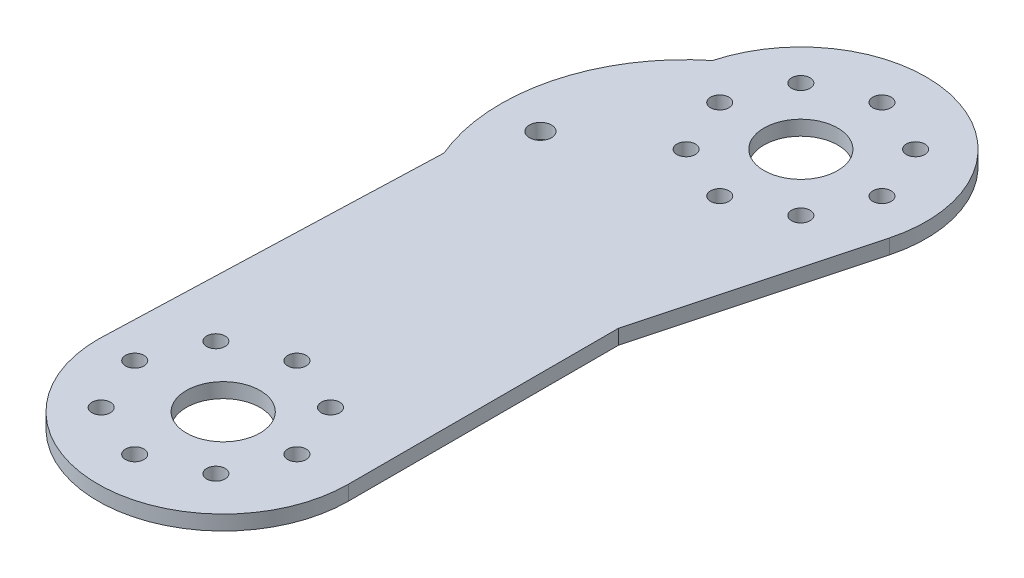
ISO-10303-21;
HEADER;
FILE_DESCRIPTION(('STEP AP214'),'2;1');
FILE_NAME('part.step','',(''),(''),'','','');
FILE_SCHEMA(('AUTOMOTIVE_DESIGN { 1 0 10303 214 1 1 1 1 }'));
ENDSEC;
DATA;
#1=APPLICATION_CONTEXT('core data for automotive mechanical design processes');
#2=APPLICATION_PROTOCOL_DEFINITION('international standard','automotive_design',2000,#1);
#3=PRODUCT_CONTEXT('',#1,'mechanical');
#4=PRODUCT('Part','Part','',(#3));
#5=PRODUCT_RELATED_PRODUCT_CATEGORY('part','',(#4));
#6=PRODUCT_DEFINITION_FORMATION('','',#4);
#7=PRODUCT_DEFINITION_CONTEXT('part definition',#1,'design');
#8=PRODUCT_DEFINITION('design','',#6,#7);
#9=PRODUCT_DEFINITION_SHAPE('','',#8);
#10=(LENGTH_UNIT() NAMED_UNIT(*) SI_UNIT(.MILLI.,.METRE.));
#11=(NAMED_UNIT(*) PLANE_ANGLE_UNIT() SI_UNIT($,.RADIAN.));
#12=(NAMED_UNIT(*) SI_UNIT($,.STERADIAN.) SOLID_ANGLE_UNIT());
#13=UNCERTAINTY_MEASURE_WITH_UNIT(LENGTH_MEASURE(1.E-05),#10,'distance_accuracy_value','');
#14=(GEOMETRIC_REPRESENTATION_CONTEXT(3) GLOBAL_UNCERTAINTY_ASSIGNED_CONTEXT((#13)) GLOBAL_UNIT_ASSIGNED_CONTEXT((#10,
#11,#12)) REPRESENTATION_CONTEXT('',''));
#15=CARTESIAN_POINT('',(0.,0.,0.));
#16=DIRECTION('',(0.,0.,1.));
#17=DIRECTION('',(1.,0.,0.));
#18=AXIS2_PLACEMENT_3D('',#15,#16,#17);
#19=CARTESIAN_POINT('',(-16.9792944272085,3.,-0.592930026825187));
#20=DIRECTION('',(-0.999390827019096,0.,-0.0348994967025082));
#21=DIRECTION('',(-0.0348994967025082,0.,0.999390827019096));
#22=AXIS2_PLACEMENT_3D('',#19,#20,#21);
#23=PLANE('',#22);
#24=DIRECTION('',(0.,1.,0.));
#25=VECTOR('',#24,1.);
#26=CARTESIAN_POINT('',(-15.4160697929704,3.,-45.3578265909523));
#27=LINE('',#26,#25);
#28=CARTESIAN_POINT('',(-15.4160697929704,1.,-45.3578265909523));
#29=VERTEX_POINT('',#28);
#30=CARTESIAN_POINT('',(-15.4160697929704,3.,-45.3578265909523));
#31=VERTEX_POINT('',#30);
#32=EDGE_CURVE('E11',#29,#31,#27,.T.);
#33=ORIENTED_EDGE('',*,*,#32,.F.);
#34=DIRECTION('',(-0.0348994967025082,0.,0.999390827019096));
#35=VECTOR('',#34,1.);
#36=CARTESIAN_POINT('',(-16.9792944272085,1.,-0.592930026825187));
#37=LINE('',#36,#35);
#38=CARTESIAN_POINT('',(-17.,1.,0.));
#39=VERTEX_POINT('',#38);
#40=EDGE_CURVE('E101',#29,#39,#37,.T.);
#41=ORIENTED_EDGE('',*,*,#40,.T.);
#42=DIRECTION('',(0.,1.,0.));
#43=VECTOR('',#42,1.);
#44=CARTESIAN_POINT('',(-17.,3.,0.));
#45=LINE('',#44,#43);
#46=CARTESIAN_POINT('',(-17.,3.,0.));
#47=VERTEX_POINT('',#46);
#48=EDGE_CURVE('E50',#39,#47,#45,.T.);
#49=ORIENTED_EDGE('',*,*,#48,.T.);
#50=DIRECTION('',(-0.0348994967025082,0.,0.999390827019096));
#51=VECTOR('',#50,1.);
#52=CARTESIAN_POINT('',(-16.9792944272085,3.,-0.592930026825187));
#53=LINE('',#52,#51);
#54=EDGE_CURVE('E131',#31,#47,#53,.T.);
#55=ORIENTED_EDGE('',*,*,#54,.F.);
#56=EDGE_LOOP('',(#33,#41,#49,#55));
#57=FACE_BOUND('',#56,.T.);
#58=ADVANCED_FACE('F40',(#57),#23,.T.);
#59=CARTESIAN_POINT('',(0.,3.,0.));
#60=DIRECTION('',(0.,1.,0.));
#61=DIRECTION('',(0.,0.,1.));
#62=AXIS2_PLACEMENT_3D('',#59,#60,#61);
#63=CYLINDRICAL_SURFACE('',#62,17.);
#64=ORIENTED_EDGE('',*,*,#48,.F.);
#65=CARTESIAN_POINT('',(0.,1.,0.));
#66=DIRECTION('',(0.,1.,0.));
#67=DIRECTION('',(0.,0.,1.));
#68=AXIS2_PLACEMENT_3D('',#65,#66,#67);
#69=CIRCLE('',#68,17.);
#70=CARTESIAN_POINT('',(17.,1.,0.));
#71=VERTEX_POINT('',#70);
#72=EDGE_CURVE('E117',#39,#71,#69,.T.);
#73=ORIENTED_EDGE('',*,*,#72,.T.);
#74=DIRECTION('',(0.,1.,0.));
#75=VECTOR('',#74,1.);
#76=CARTESIAN_POINT('',(17.,3.,0.));
#77=LINE('',#76,#75);
#78=CARTESIAN_POINT('',(17.,3.,0.));
#79=VERTEX_POINT('',#78);
#80=EDGE_CURVE('E124',#71,#79,#77,.T.);
#81=ORIENTED_EDGE('',*,*,#80,.T.);
#82=CARTESIAN_POINT('',(0.,3.,0.));
#83=DIRECTION('',(0.,1.,0.));
#84=DIRECTION('',(0.,0.,1.));
#85=AXIS2_PLACEMENT_3D('',#82,#83,#84);
#86=CIRCLE('',#85,17.);
#87=EDGE_CURVE('E139',#47,#79,#86,.T.);
#88=ORIENTED_EDGE('',*,*,#87,.F.);
#89=EDGE_LOOP('',(#64,#73,#81,#88));
#90=FACE_BOUND('',#89,.T.);
#91=ADVANCED_FACE('F142',(#90),#63,.T.);
#92=CARTESIAN_POINT('',(17.,3.,0.));
#93=DIRECTION('',(1.,0.,0.));
#94=DIRECTION('',(0.,0.,-1.));
#95=AXIS2_PLACEMENT_3D('',#92,#93,#94);
#96=PLANE('',#95);
#97=ORIENTED_EDGE('',*,*,#80,.F.);
#98=DIRECTION('',(0.,0.,1.));
#99=VECTOR('',#98,1.);
#100=CARTESIAN_POINT('',(17.,1.,0.));
#101=LINE('',#100,#99);
#102=CARTESIAN_POINT('',(17.,1.,-36.6223014445851));
#103=VERTEX_POINT('',#102);
#104=EDGE_CURVE('E114',#71,#103,#101,.F.);
#105=ORIENTED_EDGE('',*,*,#104,.T.);
#106=DIRECTION('',(0.,1.,0.));
#107=VECTOR('',#106,1.);
#108=CARTESIAN_POINT('',(17.,3.,-36.6223014445851));
#109=LINE('',#108,#107);
#110=CARTESIAN_POINT('',(17.,3.,-36.6223014445851));
#111=VERTEX_POINT('',#110);
#112=EDGE_CURVE('E122',#103,#111,#109,.T.);
#113=ORIENTED_EDGE('',*,*,#112,.T.);
#114=DIRECTION('',(0.,0.,-1.));
#115=VECTOR('',#114,1.);
#116=CARTESIAN_POINT('',(17.,3.,0.));
#117=LINE('',#116,#115);
#118=EDGE_CURVE('E143',#79,#111,#117,.T.);
#119=ORIENTED_EDGE('',*,*,#118,.F.);
#120=EDGE_LOOP('',(#97,#105,#113,#119));
#121=FACE_BOUND('',#120,.T.);
#122=ADVANCED_FACE('F228',(#121),#96,.T.);
#123=CARTESIAN_POINT('',(6.70564057102143,3.,1.79677097573857));
#124=DIRECTION('',(0.965925826289068,0.,0.258819045102521));
#125=DIRECTION('',(0.258819045102521,0.,-0.965925826289068));
#126=AXIS2_PLACEMENT_3D('',#123,#124,#125);
#127=PLANE('',#126);
#128=ORIENTED_EDGE('',*,*,#112,.F.);
#129=DIRECTION('',(0.258819045102521,0.,-0.965925826289068));
#130=VECTOR('',#129,1.);
#131=CARTESIAN_POINT('',(6.70564057102143,1.,1.79677097573857));
#132=LINE('',#131,#130);
#133=CARTESIAN_POINT('',(24.7645713530756,1.,-65.6000762332572));
#134=VERTEX_POINT('',#133);
#135=EDGE_CURVE('E111',#103,#134,#132,.T.);
#136=ORIENTED_EDGE('',*,*,#135,.T.);
#137=DIRECTION('',(0.,1.,0.));
#138=VECTOR('',#137,1.);
#139=CARTESIAN_POINT('',(24.7645713530756,3.,-65.6000762332572));
#140=LINE('',#139,#138);
#141=CARTESIAN_POINT('',(24.7645713530756,3.,-65.6000762332572));
#142=VERTEX_POINT('',#141);
#143=EDGE_CURVE('E58',#134,#142,#140,.T.);
#144=ORIENTED_EDGE('',*,*,#143,.T.);
#145=DIRECTION('',(0.258819045102521,0.,-0.965925826289068));
#146=VECTOR('',#145,1.);
#147=CARTESIAN_POINT('',(6.70564057102143,3.,1.79677097573857));
#148=LINE('',#147,#146);
#149=EDGE_CURVE('E94',#111,#142,#148,.T.);
#150=ORIENTED_EDGE('',*,*,#149,.F.);
#151=EDGE_LOOP('',(#128,#136,#144,#150));
#152=FACE_BOUND('',#151,.T.);
#153=ADVANCED_FACE('F233',(#152),#127,.T.);
#154=CARTESIAN_POINT('',(8.34383230616149,3.,-70.));
#155=DIRECTION('',(0.,1.,0.));
#156=DIRECTION('',(0.,0.,1.));
#157=AXIS2_PLACEMENT_3D('',#154,#155,#156);
#158=CYLINDRICAL_SURFACE('',#157,17.);
#159=ORIENTED_EDGE('',*,*,#143,.F.);
#160=CARTESIAN_POINT('',(8.34383230616149,1.,-70.));
#161=DIRECTION('',(0.,1.,0.));
#162=DIRECTION('',(0.,0.,1.));
#163=AXIS2_PLACEMENT_3D('',#160,#161,#162);
#164=CIRCLE('',#163,17.);
#165=CARTESIAN_POINT('',(-8.06522143351642,1.,-74.4433045549864));
#166=VERTEX_POINT('',#165);
#167=EDGE_CURVE('E99',#134,#166,#164,.T.);
#168=ORIENTED_EDGE('',*,*,#167,.T.);
#169=DIRECTION('',(0.,1.,0.));
#170=VECTOR('',#169,1.);
#171=CARTESIAN_POINT('',(-8.06522143351642,3.,-74.4433045549864));
#172=LINE('',#171,#170);
#173=CARTESIAN_POINT('',(-8.06522143351642,3.,-74.4433045549864));
#174=VERTEX_POINT('',#173);
#175=EDGE_CURVE('E44',#166,#174,#172,.T.);
#176=ORIENTED_EDGE('',*,*,#175,.T.);
#177=CARTESIAN_POINT('',(8.34383230616149,3.,-70.));
#178=DIRECTION('',(0.,1.,0.));
#179=DIRECTION('',(0.,0.,1.));
#180=AXIS2_PLACEMENT_3D('',#177,#178,#179);
#181=CIRCLE('',#180,17.);
#182=EDGE_CURVE('E333',#142,#174,#181,.T.);
#183=ORIENTED_EDGE('',*,*,#182,.F.);
#184=EDGE_LOOP('',(#159,#168,#176,#183));
#185=FACE_BOUND('',#184,.T.);
#186=ADVANCED_FACE('F103',(#185),#158,.T.);
#187=CARTESIAN_POINT('',(8.34383230616149,3.,-70.));
#188=DIRECTION('',(0.,1.,0.));
#189=DIRECTION('',(0.,0.,1.));
#190=AXIS2_PLACEMENT_3D('',#187,#188,#189);
#191=CYLINDRICAL_SURFACE('',#190,5.);
#192=CARTESIAN_POINT('',(8.34383230616149,3.,-70.));
#193=DIRECTION('',(0.,1.,0.));
#194=DIRECTION('',(0.,0.,1.));
#195=AXIS2_PLACEMENT_3D('',#192,#193,#194);
#196=CIRCLE('',#195,5.);
#197=CARTESIAN_POINT('',(8.34383230616149,3.,-65.));
#198=VERTEX_POINT('',#197);
#199=EDGE_CURVE('E113',#198,#198,#196,.T.);
#200=ORIENTED_EDGE('',*,*,#199,.T.);
#201=EDGE_LOOP('',(#200));
#202=FACE_BOUND('',#201,.T.);
#203=CARTESIAN_POINT('',(8.34383230616149,1.,-70.));
#204=DIRECTION('',(0.,1.,0.));
#205=DIRECTION('',(0.,0.,1.));
#206=AXIS2_PLACEMENT_3D('',#203,#204,#205);
#207=CIRCLE('',#206,5.);
#208=CARTESIAN_POINT('',(8.34383230616149,1.,-65.));
#209=VERTEX_POINT('',#208);
#210=EDGE_CURVE('E150',#209,#209,#207,.T.);
#211=ORIENTED_EDGE('',*,*,#210,.F.);
#212=EDGE_LOOP('',(#211));
#213=FACE_BOUND('',#212,.T.);
#214=ADVANCED_FACE('F237',(#202,#213),#191,.F.);
#215=CARTESIAN_POINT('',(8.34383230616149,3.,-59.));
#216=DIRECTION('',(0.,1.,0.));
#217=DIRECTION('',(0.,0.,1.));
#218=AXIS2_PLACEMENT_3D('',#215,#216,#217);
#219=CYLINDRICAL_SURFACE('',#218,1.25);
#220=CARTESIAN_POINT('',(8.34383230616149,3.,-59.));
#221=DIRECTION('',(0.,1.,0.));
#222=DIRECTION('',(0.,0.,1.));
#223=AXIS2_PLACEMENT_3D('',#220,#221,#222);
#224=CIRCLE('',#223,1.25);
#225=CARTESIAN_POINT('',(8.34383230616149,3.,-57.75));
#226=VERTEX_POINT('',#225);
#227=EDGE_CURVE('E347',#226,#226,#224,.T.);
#228=ORIENTED_EDGE('',*,*,#227,.T.);
#229=EDGE_LOOP('',(#228));
#230=FACE_BOUND('',#229,.T.);
#231=CARTESIAN_POINT('',(8.34383230616149,1.,-59.));
#232=DIRECTION('',(0.,1.,0.));
#233=DIRECTION('',(0.,0.,1.));
#234=AXIS2_PLACEMENT_3D('',#231,#232,#233);
#235=CIRCLE('',#234,1.25);
#236=CARTESIAN_POINT('',(8.34383230616149,1.,-57.75));
#237=VERTEX_POINT('',#236);
#238=EDGE_CURVE('E153',#237,#237,#235,.T.);
#239=ORIENTED_EDGE('',*,*,#238,.F.);
#240=EDGE_LOOP('',(#239));
#241=FACE_BOUND('',#240,.T.);
#242=ADVANCED_FACE('F241',(#230,#241),#219,.F.);
#243=CARTESIAN_POINT('',(16.1220068992135,3.,-62.221825406948));
#244=DIRECTION('',(0.,1.,0.));
#245=DIRECTION('',(0.,0.,1.));
#246=AXIS2_PLACEMENT_3D('',#243,#244,#245);
#247=CYLINDRICAL_SURFACE('',#246,1.25);
#248=CARTESIAN_POINT('',(16.1220068992135,3.,-62.221825406948));
#249=DIRECTION('',(0.,1.,0.));
#250=DIRECTION('',(0.,0.,1.));
#251=AXIS2_PLACEMENT_3D('',#248,#249,#250);
#252=CIRCLE('',#251,1.25);
#253=CARTESIAN_POINT('',(16.1220068992135,3.,-60.971825406948));
#254=VERTEX_POINT('',#253);
#255=EDGE_CURVE('E351',#254,#254,#252,.T.);
#256=ORIENTED_EDGE('',*,*,#255,.T.);
#257=EDGE_LOOP('',(#256));
#258=FACE_BOUND('',#257,.T.);
#259=CARTESIAN_POINT('',(16.1220068992135,1.,-62.221825406948));
#260=DIRECTION('',(0.,1.,0.));
#261=DIRECTION('',(0.,0.,1.));
#262=AXIS2_PLACEMENT_3D('',#259,#260,#261);
#263=CIRCLE('',#262,1.25);
#264=CARTESIAN_POINT('',(16.1220068992135,1.,-60.971825406948));
#265=VERTEX_POINT('',#264);
#266=EDGE_CURVE('E156',#265,#265,#263,.T.);
#267=ORIENTED_EDGE('',*,*,#266,.F.);
#268=EDGE_LOOP('',(#267));
#269=FACE_BOUND('',#268,.T.);
#270=ADVANCED_FACE('F247',(#258,#269),#247,.F.);
#271=CARTESIAN_POINT('',(19.3438323061615,3.,-70.));
#272=DIRECTION('',(0.,1.,0.));
#273=DIRECTION('',(0.,0.,1.));
#274=AXIS2_PLACEMENT_3D('',#271,#272,#273);
#275=CYLINDRICAL_SURFACE('',#274,1.25);
#276=CARTESIAN_POINT('',(19.3438323061615,3.,-70.));
#277=DIRECTION('',(0.,1.,0.));
#278=DIRECTION('',(0.,0.,1.));
#279=AXIS2_PLACEMENT_3D('',#276,#277,#278);
#280=CIRCLE('',#279,1.25);
#281=CARTESIAN_POINT('',(19.3438323061615,3.,-68.75));
#282=VERTEX_POINT('',#281);
#283=EDGE_CURVE('E355',#282,#282,#280,.T.);
#284=ORIENTED_EDGE('',*,*,#283,.T.);
#285=EDGE_LOOP('',(#284));
#286=FACE_BOUND('',#285,.T.);
#287=CARTESIAN_POINT('',(19.3438323061615,1.,-70.));
#288=DIRECTION('',(0.,1.,0.));
#289=DIRECTION('',(0.,0.,1.));
#290=AXIS2_PLACEMENT_3D('',#287,#288,#289);
#291=CIRCLE('',#290,1.25);
#292=CARTESIAN_POINT('',(19.3438323061615,1.,-68.75));
#293=VERTEX_POINT('',#292);
#294=EDGE_CURVE('E159',#293,#293,#291,.T.);
#295=ORIENTED_EDGE('',*,*,#294,.F.);
#296=EDGE_LOOP('',(#295));
#297=FACE_BOUND('',#296,.T.);
#298=ADVANCED_FACE('F256',(#286,#297),#275,.F.);
#299=CARTESIAN_POINT('',(16.1220068992135,3.,-77.778174593052));
#300=DIRECTION('',(0.,1.,0.));
#301=DIRECTION('',(0.,0.,1.));
#302=AXIS2_PLACEMENT_3D('',#299,#300,#301);
#303=CYLINDRICAL_SURFACE('',#302,1.25);
#304=CARTESIAN_POINT('',(16.1220068992135,3.,-77.778174593052));
#305=DIRECTION('',(0.,1.,0.));
#306=DIRECTION('',(0.,0.,1.));
#307=AXIS2_PLACEMENT_3D('',#304,#305,#306);
#308=CIRCLE('',#307,1.25);
#309=CARTESIAN_POINT('',(16.1220068992135,3.,-76.528174593052));
#310=VERTEX_POINT('',#309);
#311=EDGE_CURVE('E359',#310,#310,#308,.T.);
#312=ORIENTED_EDGE('',*,*,#311,.T.);
#313=EDGE_LOOP('',(#312));
#314=FACE_BOUND('',#313,.T.);
#315=CARTESIAN_POINT('',(16.1220068992135,1.,-77.778174593052));
#316=DIRECTION('',(0.,1.,0.));
#317=DIRECTION('',(0.,0.,1.));
#318=AXIS2_PLACEMENT_3D('',#315,#316,#317);
#319=CIRCLE('',#318,1.25);
#320=CARTESIAN_POINT('',(16.1220068992135,1.,-76.528174593052));
#321=VERTEX_POINT('',#320);
#322=EDGE_CURVE('E162',#321,#321,#319,.T.);
#323=ORIENTED_EDGE('',*,*,#322,.F.);
#324=EDGE_LOOP('',(#323));
#325=FACE_BOUND('',#324,.T.);
#326=ADVANCED_FACE('F260',(#314,#325),#303,.F.);
#327=CARTESIAN_POINT('',(8.34383230616149,3.,-81.));
#328=DIRECTION('',(0.,1.,0.));
#329=DIRECTION('',(0.,0.,1.));
#330=AXIS2_PLACEMENT_3D('',#327,#328,#329);
#331=CYLINDRICAL_SURFACE('',#330,1.25);
#332=CARTESIAN_POINT('',(8.34383230616149,3.,-81.));
#333=DIRECTION('',(0.,1.,0.));
#334=DIRECTION('',(0.,0.,1.));
#335=AXIS2_PLACEMENT_3D('',#332,#333,#334);
#336=CIRCLE('',#335,1.25);
#337=CARTESIAN_POINT('',(8.34383230616149,3.,-79.75));
#338=VERTEX_POINT('',#337);
#339=EDGE_CURVE('E363',#338,#338,#336,.T.);
#340=ORIENTED_EDGE('',*,*,#339,.T.);
#341=EDGE_LOOP('',(#340));
#342=FACE_BOUND('',#341,.T.);
#343=CARTESIAN_POINT('',(8.34383230616149,1.,-81.));
#344=DIRECTION('',(0.,1.,0.));
#345=DIRECTION('',(0.,0.,1.));
#346=AXIS2_PLACEMENT_3D('',#343,#344,#345);
#347=CIRCLE('',#346,1.25);
#348=CARTESIAN_POINT('',(8.34383230616149,1.,-79.75));
#349=VERTEX_POINT('',#348);
#350=EDGE_CURVE('E165',#349,#349,#347,.T.);
#351=ORIENTED_EDGE('',*,*,#350,.F.);
#352=EDGE_LOOP('',(#351));
#353=FACE_BOUND('',#352,.T.);
#354=ADVANCED_FACE('F264',(#342,#353),#331,.F.);
#355=CARTESIAN_POINT('',(-2.65616769383853,3.,-70.));
#356=DIRECTION('',(0.,1.,0.));
#357=DIRECTION('',(0.,0.,1.));
#358=AXIS2_PLACEMENT_3D('',#355,#356,#357);
#359=CYLINDRICAL_SURFACE('',#358,1.25);
#360=CARTESIAN_POINT('',(-2.65616769383853,3.,-70.));
#361=DIRECTION('',(0.,1.,0.));
#362=DIRECTION('',(0.,0.,1.));
#363=AXIS2_PLACEMENT_3D('',#360,#361,#362);
#364=CIRCLE('',#363,1.25);
#365=CARTESIAN_POINT('',(-2.65616769383853,3.,-68.75));
#366=VERTEX_POINT('',#365);
#367=EDGE_CURVE('E367',#366,#366,#364,.T.);
#368=ORIENTED_EDGE('',*,*,#367,.T.);
#369=EDGE_LOOP('',(#368));
#370=FACE_BOUND('',#369,.T.);
#371=CARTESIAN_POINT('',(-2.65616769383853,1.,-70.));
#372=DIRECTION('',(0.,1.,0.));
#373=DIRECTION('',(0.,0.,1.));
#374=AXIS2_PLACEMENT_3D('',#371,#372,#373);
#375=CIRCLE('',#374,1.25);
#376=CARTESIAN_POINT('',(-2.65616769383853,1.,-68.75));
#377=VERTEX_POINT('',#376);
#378=EDGE_CURVE('E168',#377,#377,#375,.T.);
#379=ORIENTED_EDGE('',*,*,#378,.F.);
#380=EDGE_LOOP('',(#379));
#381=FACE_BOUND('',#380,.T.);
#382=ADVANCED_FACE('F268',(#370,#381),#359,.F.);
#383=CARTESIAN_POINT('',(0.565657713109458,3.,-62.221825406948));
#384=DIRECTION('',(0.,1.,0.));
#385=DIRECTION('',(0.,0.,1.));
#386=AXIS2_PLACEMENT_3D('',#383,#384,#385);
#387=CYLINDRICAL_SURFACE('',#386,1.25);
#388=CARTESIAN_POINT('',(0.565657713109458,3.,-62.221825406948));
#389=DIRECTION('',(0.,1.,0.));
#390=DIRECTION('',(0.,0.,1.));
#391=AXIS2_PLACEMENT_3D('',#388,#389,#390);
#392=CIRCLE('',#391,1.25);
#393=CARTESIAN_POINT('',(0.565657713109458,3.,-60.971825406948));
#394=VERTEX_POINT('',#393);
#395=EDGE_CURVE('E371',#394,#394,#392,.T.);
#396=ORIENTED_EDGE('',*,*,#395,.T.);
#397=EDGE_LOOP('',(#396));
#398=FACE_BOUND('',#397,.T.);
#399=CARTESIAN_POINT('',(0.565657713109458,1.,-62.221825406948));
#400=DIRECTION('',(0.,1.,0.));
#401=DIRECTION('',(0.,0.,1.));
#402=AXIS2_PLACEMENT_3D('',#399,#400,#401);
#403=CIRCLE('',#402,1.25);
#404=CARTESIAN_POINT('',(0.565657713109458,1.,-60.971825406948));
#405=VERTEX_POINT('',#404);
#406=EDGE_CURVE('E171',#405,#405,#403,.T.);
#407=ORIENTED_EDGE('',*,*,#406,.F.);
#408=EDGE_LOOP('',(#407));
#409=FACE_BOUND('',#408,.T.);
#410=ADVANCED_FACE('F272',(#398,#409),#387,.F.);
#411=CARTESIAN_POINT('',(0.565657713109458,3.,-77.778174593052));
#412=DIRECTION('',(0.,1.,0.));
#413=DIRECTION('',(0.,0.,1.));
#414=AXIS2_PLACEMENT_3D('',#411,#412,#413);
#415=CYLINDRICAL_SURFACE('',#414,1.25);
#416=CARTESIAN_POINT('',(0.565657713109458,3.,-77.778174593052));
#417=DIRECTION('',(0.,1.,0.));
#418=DIRECTION('',(0.,0.,1.));
#419=AXIS2_PLACEMENT_3D('',#416,#417,#418);
#420=CIRCLE('',#419,1.25);
#421=CARTESIAN_POINT('',(0.565657713109458,3.,-76.528174593052));
#422=VERTEX_POINT('',#421);
#423=EDGE_CURVE('E375',#422,#422,#420,.T.);
#424=ORIENTED_EDGE('',*,*,#423,.T.);
#425=EDGE_LOOP('',(#424));
#426=FACE_BOUND('',#425,.T.);
#427=CARTESIAN_POINT('',(0.565657713109458,1.,-77.778174593052));
#428=DIRECTION('',(0.,1.,0.));
#429=DIRECTION('',(0.,0.,1.));
#430=AXIS2_PLACEMENT_3D('',#427,#428,#429);
#431=CIRCLE('',#430,1.25);
#432=CARTESIAN_POINT('',(0.565657713109458,1.,-76.528174593052));
#433=VERTEX_POINT('',#432);
#434=EDGE_CURVE('E174',#433,#433,#431,.T.);
#435=ORIENTED_EDGE('',*,*,#434,.F.);
#436=EDGE_LOOP('',(#435));
#437=FACE_BOUND('',#436,.T.);
#438=ADVANCED_FACE('F276',(#426,#437),#415,.F.);
#439=CARTESIAN_POINT('',(0.,3.,0.));
#440=DIRECTION('',(0.,1.,0.));
#441=DIRECTION('',(0.,0.,1.));
#442=AXIS2_PLACEMENT_3D('',#439,#440,#441);
#443=CYLINDRICAL_SURFACE('',#442,5.);
#444=CARTESIAN_POINT('',(0.,3.,0.));
#445=DIRECTION('',(0.,1.,0.));
#446=DIRECTION('',(0.,0.,1.));
#447=AXIS2_PLACEMENT_3D('',#444,#445,#446);
#448=CIRCLE('',#447,5.);
#449=CARTESIAN_POINT('',(0.,3.,5.));
#450=VERTEX_POINT('',#449);
#451=EDGE_CURVE('E379',#450,#450,#448,.T.);
#452=ORIENTED_EDGE('',*,*,#451,.T.);
#453=EDGE_LOOP('',(#452));
#454=FACE_BOUND('',#453,.T.);
#455=CARTESIAN_POINT('',(0.,1.,0.));
#456=DIRECTION('',(0.,1.,0.));
#457=DIRECTION('',(0.,0.,1.));
#458=AXIS2_PLACEMENT_3D('',#455,#456,#457);
#459=CIRCLE('',#458,5.);
#460=CARTESIAN_POINT('',(0.,1.,5.));
#461=VERTEX_POINT('',#460);
#462=EDGE_CURVE('E177',#461,#461,#459,.T.);
#463=ORIENTED_EDGE('',*,*,#462,.F.);
#464=EDGE_LOOP('',(#463));
#465=FACE_BOUND('',#464,.T.);
#466=ADVANCED_FACE('F280',(#454,#465),#443,.F.);
#467=CARTESIAN_POINT('',(-11.4160697929704,3.,-54.4433045549864));
#468=DIRECTION('',(0.,1.,0.));
#469=DIRECTION('',(0.,0.,1.));
#470=AXIS2_PLACEMENT_3D('',#467,#468,#469);
#471=CYLINDRICAL_SURFACE('',#470,1.5);
#472=CARTESIAN_POINT('',(-11.4160697929704,3.,-54.4433045549864));
#473=DIRECTION('',(0.,1.,0.));
#474=DIRECTION('',(0.,0.,1.));
#475=AXIS2_PLACEMENT_3D('',#472,#473,#474);
#476=CIRCLE('',#475,1.5);
#477=CARTESIAN_POINT('',(-11.4160697929704,3.,-52.9433045549864));
#478=VERTEX_POINT('',#477);
#479=EDGE_CURVE('E383',#478,#478,#476,.T.);
#480=ORIENTED_EDGE('',*,*,#479,.T.);
#481=EDGE_LOOP('',(#480));
#482=FACE_BOUND('',#481,.T.);
#483=CARTESIAN_POINT('',(-11.4160697929704,1.,-54.4433045549864));
#484=DIRECTION('',(0.,1.,0.));
#485=DIRECTION('',(0.,0.,1.));
#486=AXIS2_PLACEMENT_3D('',#483,#484,#485);
#487=CIRCLE('',#486,1.5);
#488=CARTESIAN_POINT('',(-11.4160697929704,1.,-52.9433045549864));
#489=VERTEX_POINT('',#488);
#490=EDGE_CURVE('E180',#489,#489,#487,.T.);
#491=ORIENTED_EDGE('',*,*,#490,.F.);
#492=EDGE_LOOP('',(#491));
#493=FACE_BOUND('',#492,.T.);
#494=ADVANCED_FACE('F284',(#482,#493),#471,.F.);
#495=CARTESIAN_POINT('',(-0.999999999999996,3.,-11.));
#496=DIRECTION('',(0.,1.,0.));
#497=DIRECTION('',(0.,0.,1.));
#498=AXIS2_PLACEMENT_3D('',#495,#496,#497);
#499=CYLINDRICAL_SURFACE('',#498,1.25);
#500=CARTESIAN_POINT('',(-0.999999999999996,3.,-11.));
#501=DIRECTION('',(0.,1.,0.));
#502=DIRECTION('',(0.,0.,1.));
#503=AXIS2_PLACEMENT_3D('',#500,#501,#502);
#504=CIRCLE('',#503,1.25);
#505=CARTESIAN_POINT('',(-0.999999999999996,3.,-9.75));
#506=VERTEX_POINT('',#505);
#507=EDGE_CURVE('E387',#506,#506,#504,.F.);
#508=ORIENTED_EDGE('',*,*,#507,.F.);
#509=EDGE_LOOP('',(#508));
#510=FACE_BOUND('',#509,.T.);
#511=CARTESIAN_POINT('',(-0.999999999999996,1.,-11.));
#512=DIRECTION('',(0.,1.,0.));
#513=DIRECTION('',(0.,0.,1.));
#514=AXIS2_PLACEMENT_3D('',#511,#512,#513);
#515=CIRCLE('',#514,1.25);
#516=CARTESIAN_POINT('',(-0.999999999999996,1.,-9.75));
#517=VERTEX_POINT('',#516);
#518=EDGE_CURVE('E183',#517,#517,#515,.F.);
#519=ORIENTED_EDGE('',*,*,#518,.T.);
#520=EDGE_LOOP('',(#519));
#521=FACE_BOUND('',#520,.T.);
#522=ADVANCED_FACE('F288',(#510,#521),#499,.F.);
#523=CARTESIAN_POINT('',(-8.77817459305202,3.,-7.77817459305202));
#524=DIRECTION('',(0.,1.,0.));
#525=DIRECTION('',(0.,0.,1.));
#526=AXIS2_PLACEMENT_3D('',#523,#524,#525);
#527=CYLINDRICAL_SURFACE('',#526,1.25);
#528=CARTESIAN_POINT('',(-8.77817459305202,3.,-7.77817459305202));
#529=DIRECTION('',(0.,1.,0.));
#530=DIRECTION('',(0.,0.,1.));
#531=AXIS2_PLACEMENT_3D('',#528,#529,#530);
#532=CIRCLE('',#531,1.25);
#533=CARTESIAN_POINT('',(-8.77817459305202,3.,-6.52817459305202));
#534=VERTEX_POINT('',#533);
#535=EDGE_CURVE('E391',#534,#534,#532,.F.);
#536=ORIENTED_EDGE('',*,*,#535,.F.);
#537=EDGE_LOOP('',(#536));
#538=FACE_BOUND('',#537,.T.);
#539=CARTESIAN_POINT('',(-8.77817459305202,1.,-7.77817459305202));
#540=DIRECTION('',(0.,1.,0.));
#541=DIRECTION('',(0.,0.,1.));
#542=AXIS2_PLACEMENT_3D('',#539,#540,#541);
#543=CIRCLE('',#542,1.25);
#544=CARTESIAN_POINT('',(-8.77817459305202,1.,-6.52817459305202));
#545=VERTEX_POINT('',#544);
#546=EDGE_CURVE('E186',#545,#545,#543,.F.);
#547=ORIENTED_EDGE('',*,*,#546,.T.);
#548=EDGE_LOOP('',(#547));
#549=FACE_BOUND('',#548,.T.);
#550=ADVANCED_FACE('F292',(#538,#549),#527,.F.);
#551=CARTESIAN_POINT('',(-12.,3.,0.));
#552=DIRECTION('',(0.,1.,0.));
#553=DIRECTION('',(0.,0.,1.));
#554=AXIS2_PLACEMENT_3D('',#551,#552,#553);
#555=CYLINDRICAL_SURFACE('',#554,1.25);
#556=CARTESIAN_POINT('',(-12.,3.,0.));
#557=DIRECTION('',(0.,1.,0.));
#558=DIRECTION('',(0.,0.,1.));
#559=AXIS2_PLACEMENT_3D('',#556,#557,#558);
#560=CIRCLE('',#559,1.25);
#561=CARTESIAN_POINT('',(-12.,3.,1.25));
#562=VERTEX_POINT('',#561);
#563=EDGE_CURVE('E395',#562,#562,#560,.F.);
#564=ORIENTED_EDGE('',*,*,#563,.F.);
#565=EDGE_LOOP('',(#564));
#566=FACE_BOUND('',#565,.T.);
#567=CARTESIAN_POINT('',(-12.,1.,0.));
#568=DIRECTION('',(0.,1.,0.));
#569=DIRECTION('',(0.,0.,1.));
#570=AXIS2_PLACEMENT_3D('',#567,#568,#569);
#571=CIRCLE('',#570,1.25);
#572=CARTESIAN_POINT('',(-12.,1.,1.25));
#573=VERTEX_POINT('',#572);
#574=EDGE_CURVE('E189',#573,#573,#571,.F.);
#575=ORIENTED_EDGE('',*,*,#574,.T.);
#576=EDGE_LOOP('',(#575));
#577=FACE_BOUND('',#576,.T.);
#578=ADVANCED_FACE('F296',(#566,#577),#555,.F.);
#579=CARTESIAN_POINT('',(-8.77817459305201,3.,7.77817459305202));
#580=DIRECTION('',(0.,1.,0.));
#581=DIRECTION('',(0.,0.,1.));
#582=AXIS2_PLACEMENT_3D('',#579,#580,#581);
#583=CYLINDRICAL_SURFACE('',#582,1.25);
#584=CARTESIAN_POINT('',(-8.77817459305201,3.,7.77817459305202));
#585=DIRECTION('',(0.,1.,0.));
#586=DIRECTION('',(0.,0.,1.));
#587=AXIS2_PLACEMENT_3D('',#584,#585,#586);
#588=CIRCLE('',#587,1.25);
#589=CARTESIAN_POINT('',(-8.77817459305201,3.,9.02817459305202));
#590=VERTEX_POINT('',#589);
#591=EDGE_CURVE('E327',#590,#590,#588,.F.);
#592=ORIENTED_EDGE('',*,*,#591,.F.);
#593=EDGE_LOOP('',(#592));
#594=FACE_BOUND('',#593,.T.);
#595=CARTESIAN_POINT('',(-8.77817459305201,1.,7.77817459305202));
#596=DIRECTION('',(0.,1.,0.));
#597=DIRECTION('',(0.,0.,1.));
#598=AXIS2_PLACEMENT_3D('',#595,#596,#597);
#599=CIRCLE('',#598,1.25);
#600=CARTESIAN_POINT('',(-8.77817459305201,1.,9.02817459305202));
#601=VERTEX_POINT('',#600);
#602=EDGE_CURVE('E192',#601,#601,#599,.F.);
#603=ORIENTED_EDGE('',*,*,#602,.T.);
#604=EDGE_LOOP('',(#603));
#605=FACE_BOUND('',#604,.T.);
#606=ADVANCED_FACE('F300',(#594,#605),#583,.F.);
#607=CARTESIAN_POINT('',(-0.999999999999993,3.,11.));
#608=DIRECTION('',(0.,1.,0.));
#609=DIRECTION('',(0.,0.,1.));
#610=AXIS2_PLACEMENT_3D('',#607,#608,#609);
#611=CYLINDRICAL_SURFACE('',#610,1.25);
#612=CARTESIAN_POINT('',(-0.999999999999993,3.,11.));
#613=DIRECTION('',(0.,1.,0.));
#614=DIRECTION('',(0.,0.,1.));
#615=AXIS2_PLACEMENT_3D('',#612,#613,#614);
#616=CIRCLE('',#615,1.25);
#617=CARTESIAN_POINT('',(-0.999999999999993,3.,12.25));
#618=VERTEX_POINT('',#617);
#619=EDGE_CURVE('E321',#618,#618,#616,.F.);
#620=ORIENTED_EDGE('',*,*,#619,.F.);
#621=EDGE_LOOP('',(#620));
#622=FACE_BOUND('',#621,.T.);
#623=CARTESIAN_POINT('',(-0.999999999999993,1.,11.));
#624=DIRECTION('',(0.,1.,0.));
#625=DIRECTION('',(0.,0.,1.));
#626=AXIS2_PLACEMENT_3D('',#623,#624,#625);
#627=CIRCLE('',#626,1.25);
#628=CARTESIAN_POINT('',(-0.999999999999993,1.,12.25));
#629=VERTEX_POINT('',#628);
#630=EDGE_CURVE('E195',#629,#629,#627,.F.);
#631=ORIENTED_EDGE('',*,*,#630,.T.);
#632=EDGE_LOOP('',(#631));
#633=FACE_BOUND('',#632,.T.);
#634=ADVANCED_FACE('F304',(#622,#633),#611,.F.);
#635=CARTESIAN_POINT('',(6.77817459305203,3.,7.77817459305202));
#636=DIRECTION('',(0.,1.,0.));
#637=DIRECTION('',(0.,0.,1.));
#638=AXIS2_PLACEMENT_3D('',#635,#636,#637);
#639=CYLINDRICAL_SURFACE('',#638,1.25);
#640=CARTESIAN_POINT('',(6.77817459305203,3.,7.77817459305202));
#641=DIRECTION('',(0.,1.,0.));
#642=DIRECTION('',(0.,0.,1.));
#643=AXIS2_PLACEMENT_3D('',#640,#641,#642);
#644=CIRCLE('',#643,1.25);
#645=CARTESIAN_POINT('',(6.77817459305203,3.,9.02817459305202));
#646=VERTEX_POINT('',#645);
#647=EDGE_CURVE('E316',#646,#646,#644,.F.);
#648=ORIENTED_EDGE('',*,*,#647,.F.);
#649=EDGE_LOOP('',(#648));
#650=FACE_BOUND('',#649,.T.);
#651=CARTESIAN_POINT('',(6.77817459305203,1.,7.77817459305202));
#652=DIRECTION('',(0.,1.,0.));
#653=DIRECTION('',(0.,0.,1.));
#654=AXIS2_PLACEMENT_3D('',#651,#652,#653);
#655=CIRCLE('',#654,1.25);
#656=CARTESIAN_POINT('',(6.77817459305203,1.,9.02817459305202));
#657=VERTEX_POINT('',#656);
#658=EDGE_CURVE('E198',#657,#657,#655,.F.);
#659=ORIENTED_EDGE('',*,*,#658,.T.);
#660=EDGE_LOOP('',(#659));
#661=FACE_BOUND('',#660,.T.);
#662=ADVANCED_FACE('F219',(#650,#661),#639,.F.);
#663=CARTESIAN_POINT('',(10.,3.,0.));
#664=DIRECTION('',(0.,1.,0.));
#665=DIRECTION('',(0.,0.,1.));
#666=AXIS2_PLACEMENT_3D('',#663,#664,#665);
#667=CYLINDRICAL_SURFACE('',#666,1.25);
#668=CARTESIAN_POINT('',(10.,3.,0.));
#669=DIRECTION('',(0.,1.,0.));
#670=DIRECTION('',(0.,0.,1.));
#671=AXIS2_PLACEMENT_3D('',#668,#669,#670);
#672=CIRCLE('',#671,1.25);
#673=CARTESIAN_POINT('',(10.,3.,1.25));
#674=VERTEX_POINT('',#673);
#675=EDGE_CURVE('E320',#674,#674,#672,.F.);
#676=ORIENTED_EDGE('',*,*,#675,.F.);
#677=EDGE_LOOP('',(#676));
#678=FACE_BOUND('',#677,.T.);
#679=CARTESIAN_POINT('',(10.,1.,0.));
#680=DIRECTION('',(0.,1.,0.));
#681=DIRECTION('',(0.,0.,1.));
#682=AXIS2_PLACEMENT_3D('',#679,#680,#681);
#683=CIRCLE('',#682,1.25);
#684=CARTESIAN_POINT('',(10.,1.,1.25));
#685=VERTEX_POINT('',#684);
#686=EDGE_CURVE('E107',#685,#685,#683,.F.);
#687=ORIENTED_EDGE('',*,*,#686,.T.);
#688=EDGE_LOOP('',(#687));
#689=FACE_BOUND('',#688,.T.);
#690=ADVANCED_FACE('F203',(#678,#689),#667,.F.);
#691=CARTESIAN_POINT('',(6.77817459305203,3.,-7.77817459305202));
#692=DIRECTION('',(0.,1.,0.));
#693=DIRECTION('',(0.,0.,1.));
#694=AXIS2_PLACEMENT_3D('',#691,#692,#693);
#695=CYLINDRICAL_SURFACE('',#694,1.25);
#696=CARTESIAN_POINT('',(6.77817459305203,3.,-7.77817459305202));
#697=DIRECTION('',(0.,1.,0.));
#698=DIRECTION('',(0.,0.,1.));
#699=AXIS2_PLACEMENT_3D('',#696,#697,#698);
#700=CIRCLE('',#699,1.25);
#701=CARTESIAN_POINT('',(6.77817459305203,3.,-6.52817459305202));
#702=VERTEX_POINT('',#701);
#703=EDGE_CURVE('E324',#702,#702,#700,.F.);
#704=ORIENTED_EDGE('',*,*,#703,.F.);
#705=EDGE_LOOP('',(#704));
#706=FACE_BOUND('',#705,.T.);
#707=CARTESIAN_POINT('',(6.77817459305203,1.,-7.77817459305202));
#708=DIRECTION('',(0.,1.,0.));
#709=DIRECTION('',(0.,0.,1.));
#710=AXIS2_PLACEMENT_3D('',#707,#708,#709);
#711=CIRCLE('',#710,1.25);
#712=CARTESIAN_POINT('',(6.77817459305203,1.,-6.52817459305202));
#713=VERTEX_POINT('',#712);
#714=EDGE_CURVE('E104',#713,#713,#711,.F.);
#715=ORIENTED_EDGE('',*,*,#714,.T.);
#716=EDGE_LOOP('',(#715));
#717=FACE_BOUND('',#716,.T.);
#718=ADVANCED_FACE('F211',(#706,#717),#695,.F.);
#719=CARTESIAN_POINT('',(7.64967302944601,3.,-55.));
#720=DIRECTION('',(0.,1.,0.));
#721=DIRECTION('',(0.,0.,1.));
#722=AXIS2_PLACEMENT_3D('',#719,#720,#721);
#723=CYLINDRICAL_SURFACE('',#722,25.);
#724=CARTESIAN_POINT('',(7.64967302944601,1.,-55.));
#725=DIRECTION('',(0.,1.,0.));
#726=DIRECTION('',(0.,0.,1.));
#727=AXIS2_PLACEMENT_3D('',#724,#725,#726);
#728=CIRCLE('',#727,25.);
#729=EDGE_CURVE('E88',#166,#29,#728,.T.);
#730=ORIENTED_EDGE('',*,*,#729,.T.);
#731=ORIENTED_EDGE('',*,*,#32,.T.);
#732=CARTESIAN_POINT('',(7.64967302944601,3.,-55.));
#733=DIRECTION('',(0.,1.,0.));
#734=DIRECTION('',(0.,0.,1.));
#735=AXIS2_PLACEMENT_3D('',#732,#733,#734);
#736=CIRCLE('',#735,25.);
#737=EDGE_CURVE('E90',#174,#31,#736,.T.);
#738=ORIENTED_EDGE('',*,*,#737,.F.);
#739=ORIENTED_EDGE('',*,*,#175,.F.);
#740=EDGE_LOOP('',(#730,#731,#738,#739));
#741=FACE_BOUND('',#740,.T.);
#742=ADVANCED_FACE('F42',(#741),#723,.T.);
#743=CARTESIAN_POINT('',(0.,3.,0.));
#744=DIRECTION('',(0.,1.,0.));
#745=DIRECTION('',(0.,0.,1.));
#746=AXIS2_PLACEMENT_3D('',#743,#744,#745);
#747=PLANE('',#746);
#748=ORIENTED_EDGE('',*,*,#199,.F.);
#749=EDGE_LOOP('',(#748));
#750=FACE_BOUND('',#749,.T.);
#751=ORIENTED_EDGE('',*,*,#227,.F.);
#752=EDGE_LOOP('',(#751));
#753=FACE_BOUND('',#752,.T.);
#754=ORIENTED_EDGE('',*,*,#255,.F.);
#755=EDGE_LOOP('',(#754));
#756=FACE_BOUND('',#755,.T.);
#757=ORIENTED_EDGE('',*,*,#283,.F.);
#758=EDGE_LOOP('',(#757));
#759=FACE_BOUND('',#758,.T.);
#760=ORIENTED_EDGE('',*,*,#311,.F.);
#761=EDGE_LOOP('',(#760));
#762=FACE_BOUND('',#761,.T.);
#763=ORIENTED_EDGE('',*,*,#339,.F.);
#764=EDGE_LOOP('',(#763));
#765=FACE_BOUND('',#764,.T.);
#766=ORIENTED_EDGE('',*,*,#367,.F.);
#767=EDGE_LOOP('',(#766));
#768=FACE_BOUND('',#767,.T.);
#769=ORIENTED_EDGE('',*,*,#395,.F.);
#770=EDGE_LOOP('',(#769));
#771=FACE_BOUND('',#770,.T.);
#772=ORIENTED_EDGE('',*,*,#423,.F.);
#773=EDGE_LOOP('',(#772));
#774=FACE_BOUND('',#773,.T.);
#775=ORIENTED_EDGE('',*,*,#451,.F.);
#776=EDGE_LOOP('',(#775));
#777=FACE_BOUND('',#776,.T.);
#778=ORIENTED_EDGE('',*,*,#479,.F.);
#779=EDGE_LOOP('',(#778));
#780=FACE_BOUND('',#779,.T.);
#781=ORIENTED_EDGE('',*,*,#507,.T.);
#782=EDGE_LOOP('',(#781));
#783=FACE_BOUND('',#782,.T.);
#784=ORIENTED_EDGE('',*,*,#535,.T.);
#785=EDGE_LOOP('',(#784));
#786=FACE_BOUND('',#785,.T.);
#787=ORIENTED_EDGE('',*,*,#563,.T.);
#788=EDGE_LOOP('',(#787));
#789=FACE_BOUND('',#788,.T.);
#790=ORIENTED_EDGE('',*,*,#591,.T.);
#791=EDGE_LOOP('',(#790));
#792=FACE_BOUND('',#791,.T.);
#793=ORIENTED_EDGE('',*,*,#619,.T.);
#794=EDGE_LOOP('',(#793));
#795=FACE_BOUND('',#794,.T.);
#796=ORIENTED_EDGE('',*,*,#647,.T.);
#797=EDGE_LOOP('',(#796));
#798=FACE_BOUND('',#797,.T.);
#799=ORIENTED_EDGE('',*,*,#675,.T.);
#800=EDGE_LOOP('',(#799));
#801=FACE_BOUND('',#800,.T.);
#802=ORIENTED_EDGE('',*,*,#703,.T.);
#803=EDGE_LOOP('',(#802));
#804=FACE_BOUND('',#803,.T.);
#805=ORIENTED_EDGE('',*,*,#182,.T.);
#806=ORIENTED_EDGE('',*,*,#737,.T.);
#807=ORIENTED_EDGE('',*,*,#54,.T.);
#808=ORIENTED_EDGE('',*,*,#87,.T.);
#809=ORIENTED_EDGE('',*,*,#118,.T.);
#810=ORIENTED_EDGE('',*,*,#149,.T.);
#811=EDGE_LOOP('',(#805,#806,#807,#808,#809,#810));
#812=FACE_BOUND('',#811,.T.);
#813=ADVANCED_FACE('F137',(#750,#753,#756,#759,#762,#765,#768,#771,#774,#777,#780,#783,#786,
#789,#792,#795,#798,#801,#804,#812),#747,.T.);
#814=CARTESIAN_POINT('',(0.,1.,0.));
#815=DIRECTION('',(0.,1.,0.));
#816=DIRECTION('',(0.,0.,1.));
#817=AXIS2_PLACEMENT_3D('',#814,#815,#816);
#818=PLANE('',#817);
#819=ORIENTED_EDGE('',*,*,#210,.T.);
#820=EDGE_LOOP('',(#819));
#821=FACE_BOUND('',#820,.T.);
#822=ORIENTED_EDGE('',*,*,#238,.T.);
#823=EDGE_LOOP('',(#822));
#824=FACE_BOUND('',#823,.T.);
#825=ORIENTED_EDGE('',*,*,#266,.T.);
#826=EDGE_LOOP('',(#825));
#827=FACE_BOUND('',#826,.T.);
#828=ORIENTED_EDGE('',*,*,#294,.T.);
#829=EDGE_LOOP('',(#828));
#830=FACE_BOUND('',#829,.T.);
#831=ORIENTED_EDGE('',*,*,#322,.T.);
#832=EDGE_LOOP('',(#831));
#833=FACE_BOUND('',#832,.T.);
#834=ORIENTED_EDGE('',*,*,#350,.T.);
#835=EDGE_LOOP('',(#834));
#836=FACE_BOUND('',#835,.T.);
#837=ORIENTED_EDGE('',*,*,#378,.T.);
#838=EDGE_LOOP('',(#837));
#839=FACE_BOUND('',#838,.T.);
#840=ORIENTED_EDGE('',*,*,#406,.T.);
#841=EDGE_LOOP('',(#840));
#842=FACE_BOUND('',#841,.T.);
#843=ORIENTED_EDGE('',*,*,#434,.T.);
#844=EDGE_LOOP('',(#843));
#845=FACE_BOUND('',#844,.T.);
#846=ORIENTED_EDGE('',*,*,#462,.T.);
#847=EDGE_LOOP('',(#846));
#848=FACE_BOUND('',#847,.T.);
#849=ORIENTED_EDGE('',*,*,#490,.T.);
#850=EDGE_LOOP('',(#849));
#851=FACE_BOUND('',#850,.T.);
#852=ORIENTED_EDGE('',*,*,#518,.F.);
#853=EDGE_LOOP('',(#852));
#854=FACE_BOUND('',#853,.T.);
#855=ORIENTED_EDGE('',*,*,#546,.F.);
#856=EDGE_LOOP('',(#855));
#857=FACE_BOUND('',#856,.T.);
#858=ORIENTED_EDGE('',*,*,#574,.F.);
#859=EDGE_LOOP('',(#858));
#860=FACE_BOUND('',#859,.T.);
#861=ORIENTED_EDGE('',*,*,#602,.F.);
#862=EDGE_LOOP('',(#861));
#863=FACE_BOUND('',#862,.T.);
#864=ORIENTED_EDGE('',*,*,#630,.F.);
#865=EDGE_LOOP('',(#864));
#866=FACE_BOUND('',#865,.T.);
#867=ORIENTED_EDGE('',*,*,#658,.F.);
#868=EDGE_LOOP('',(#867));
#869=FACE_BOUND('',#868,.T.);
#870=ORIENTED_EDGE('',*,*,#686,.F.);
#871=EDGE_LOOP('',(#870));
#872=FACE_BOUND('',#871,.T.);
#873=ORIENTED_EDGE('',*,*,#714,.F.);
#874=EDGE_LOOP('',(#873));
#875=FACE_BOUND('',#874,.T.);
#876=ORIENTED_EDGE('',*,*,#167,.F.);
#877=ORIENTED_EDGE('',*,*,#135,.F.);
#878=ORIENTED_EDGE('',*,*,#104,.F.);
#879=ORIENTED_EDGE('',*,*,#72,.F.);
#880=ORIENTED_EDGE('',*,*,#40,.F.);
#881=ORIENTED_EDGE('',*,*,#729,.F.);
#882=EDGE_LOOP('',(#876,#877,#878,#879,#880,#881));
#883=FACE_BOUND('',#882,.T.);
#884=ADVANCED_FACE('F97',(#821,#824,#827,#830,#833,#836,#839,#842,#845,#848,#851,#854,#857,#860,
#863,#866,#869,#872,#875,#883),#818,.F.);
#885=CLOSED_SHELL('',(#58,#91,#122,#153,#186,#214,#242,#270,#298,#326,#354,#382,#410,#438,#466,
#494,#522,#550,#578,#606,#634,#662,#690,#718,#742,#813,#884));
#886=MANIFOLD_SOLID_BREP('B2',#885);
#887=ADVANCED_BREP_SHAPE_REPRESENTATION('',(#18,#886),#14);
#888=SHAPE_DEFINITION_REPRESENTATION(#9,#887);
ENDSEC;
END-ISO-10303-21;
